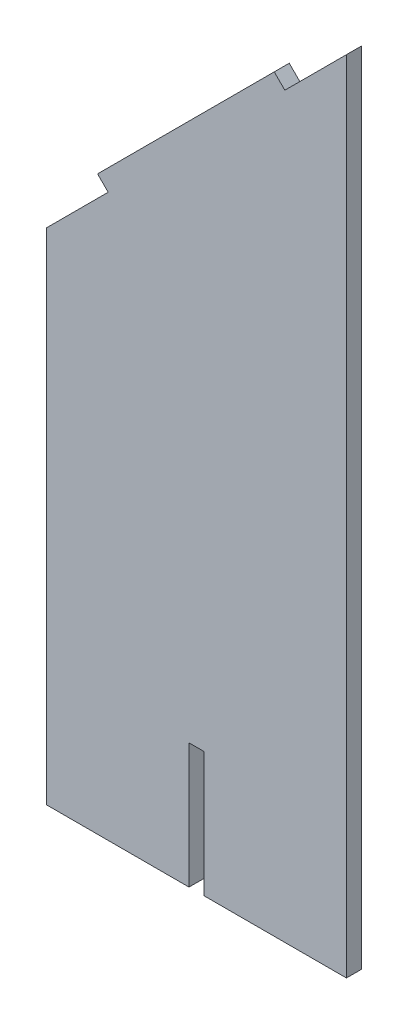
ISO-10303-21;
HEADER;
FILE_DESCRIPTION(('STEP AP214'),'2;1');
FILE_NAME('part.step','',(''),(''),'','','');
FILE_SCHEMA(('AUTOMOTIVE_DESIGN { 1 0 10303 214 1 1 1 1 }'));
ENDSEC;
DATA;
#1=APPLICATION_CONTEXT('core data for automotive mechanical design processes');
#2=APPLICATION_PROTOCOL_DEFINITION('international standard','automotive_design',2000,#1);
#3=PRODUCT_CONTEXT('',#1,'mechanical');
#4=PRODUCT('Part','Part','',(#3));
#5=PRODUCT_RELATED_PRODUCT_CATEGORY('part','',(#4));
#6=PRODUCT_DEFINITION_FORMATION('','',#4);
#7=PRODUCT_DEFINITION_CONTEXT('part definition',#1,'design');
#8=PRODUCT_DEFINITION('design','',#6,#7);
#9=PRODUCT_DEFINITION_SHAPE('','',#8);
#10=(LENGTH_UNIT() NAMED_UNIT(*) SI_UNIT(.MILLI.,.METRE.));
#11=(NAMED_UNIT(*) PLANE_ANGLE_UNIT() SI_UNIT($,.RADIAN.));
#12=(NAMED_UNIT(*) SI_UNIT($,.STERADIAN.) SOLID_ANGLE_UNIT());
#13=UNCERTAINTY_MEASURE_WITH_UNIT(LENGTH_MEASURE(1.E-05),#10,'distance_accuracy_value','');
#14=(GEOMETRIC_REPRESENTATION_CONTEXT(3) GLOBAL_UNCERTAINTY_ASSIGNED_CONTEXT((#13)) GLOBAL_UNIT_ASSIGNED_CONTEXT((#10,
#11,#12)) REPRESENTATION_CONTEXT('',''));
#15=CARTESIAN_POINT('',(0.,0.,0.));
#16=DIRECTION('',(0.,0.,1.));
#17=DIRECTION('',(1.,0.,0.));
#18=AXIS2_PLACEMENT_3D('',#15,#16,#17);
#19=CARTESIAN_POINT('',(-50.,49.9999999999998,3.));
#20=DIRECTION('',(-0.707106781186548,0.707106781186547,0.));
#21=DIRECTION('',(-0.707106781186547,-0.707106781186548,0.));
#22=AXIS2_PLACEMENT_3D('',#19,#20,#21);
#23=PLANE('',#22);
#24=DIRECTION('',(0.707106781186547,0.707106781186548,0.));
#25=VECTOR('',#24,1.);
#26=CARTESIAN_POINT('',(-50.,49.9999999999998,0.));
#27=LINE('',#26,#25);
#28=CARTESIAN_POINT('',(47.676674721503,147.676674721503,0.));
#29=VERTEX_POINT('',#28);
#30=CARTESIAN_POINT('',(60.,160.,0.));
#31=VERTEX_POINT('',#30);
#32=EDGE_CURVE('E154',#29,#31,#27,.T.);
#33=ORIENTED_EDGE('',*,*,#32,.F.);
#34=DIRECTION('',(0.,0.,-1.));
#35=VECTOR('',#34,1.);
#36=CARTESIAN_POINT('',(47.676674721503,147.676674721503,3.));
#37=LINE('',#36,#35);
#38=CARTESIAN_POINT('',(47.676674721503,147.676674721503,3.));
#39=VERTEX_POINT('',#38);
#40=EDGE_CURVE('E11',#39,#29,#37,.T.);
#41=ORIENTED_EDGE('',*,*,#40,.F.);
#42=DIRECTION('',(0.707106781186547,0.707106781186548,0.));
#43=VECTOR('',#42,1.);
#44=CARTESIAN_POINT('',(-50.,49.9999999999998,3.));
#45=LINE('',#44,#43);
#46=CARTESIAN_POINT('',(60.,160.,3.));
#47=VERTEX_POINT('',#46);
#48=EDGE_CURVE('E183',#39,#47,#45,.T.);
#49=ORIENTED_EDGE('',*,*,#48,.T.);
#50=DIRECTION('',(0.,0.,-1.));
#51=VECTOR('',#50,1.);
#52=CARTESIAN_POINT('',(60.,160.,3.));
#53=LINE('',#52,#51);
#54=EDGE_CURVE('E53',#47,#31,#53,.T.);
#55=ORIENTED_EDGE('',*,*,#54,.T.);
#56=EDGE_LOOP('',(#33,#41,#49,#55));
#57=FACE_BOUND('',#56,.T.);
#58=ADVANCED_FACE('F37',(#57),#23,.T.);
#59=CARTESIAN_POINT('',(97.6766747215031,97.6766747215025,3.));
#60=DIRECTION('',(0.70710678118655,0.707106781186545,0.));
#61=DIRECTION('',(-0.707106781186545,0.70710678118655,0.));
#62=AXIS2_PLACEMENT_3D('',#59,#60,#61);
#63=PLANE('',#62);
#64=DIRECTION('',(0.707106781186545,-0.70710678118655,0.));
#65=VECTOR('',#64,1.);
#66=CARTESIAN_POINT('',(97.6766747215031,97.6766747215025,0.));
#67=LINE('',#66,#65);
#68=CARTESIAN_POINT('',(45.5553543779433,149.797995065063,0.));
#69=VERTEX_POINT('',#68);
#70=EDGE_CURVE('E156',#69,#29,#67,.T.);
#71=ORIENTED_EDGE('',*,*,#70,.F.);
#72=DIRECTION('',(0.,0.,-1.));
#73=VECTOR('',#72,1.);
#74=CARTESIAN_POINT('',(45.5553543779433,149.797995065063,3.));
#75=LINE('',#74,#73);
#76=CARTESIAN_POINT('',(45.5553543779433,149.797995065063,3.));
#77=VERTEX_POINT('',#76);
#78=EDGE_CURVE('E45',#77,#69,#75,.T.);
#79=ORIENTED_EDGE('',*,*,#78,.F.);
#80=DIRECTION('',(0.707106781186545,-0.70710678118655,0.));
#81=VECTOR('',#80,1.);
#82=CARTESIAN_POINT('',(97.6766747215031,97.6766747215025,3.));
#83=LINE('',#82,#81);
#84=EDGE_CURVE('E222',#77,#39,#83,.T.);
#85=ORIENTED_EDGE('',*,*,#84,.T.);
#86=ORIENTED_EDGE('',*,*,#40,.T.);
#87=EDGE_LOOP('',(#71,#79,#85,#86));
#88=FACE_BOUND('',#87,.T.);
#89=ADVANCED_FACE('F210',(#88),#63,.T.);
#90=CARTESIAN_POINT('',(-52.1213203435597,52.1213203435596,3.));
#91=DIRECTION('',(-0.707106781186548,0.707106781186547,0.));
#92=DIRECTION('',(-0.707106781186547,-0.707106781186548,0.));
#93=AXIS2_PLACEMENT_3D('',#90,#91,#92);
#94=PLANE('',#93);
#95=DIRECTION('',(0.707106781186547,0.707106781186548,0.));
#96=VECTOR('',#95,1.);
#97=CARTESIAN_POINT('',(-52.1213203435597,52.1213203435596,0.));
#98=LINE('',#97,#96);
#99=CARTESIAN_POINT('',(10.2000153186159,114.442656005735,0.));
#100=VERTEX_POINT('',#99);
#101=EDGE_CURVE('E159',#100,#69,#98,.T.);
#102=ORIENTED_EDGE('',*,*,#101,.F.);
#103=DIRECTION('',(0.,0.,-1.));
#104=VECTOR('',#103,1.);
#105=CARTESIAN_POINT('',(10.2000153186159,114.442656005735,3.));
#106=LINE('',#105,#104);
#107=CARTESIAN_POINT('',(10.2000153186159,114.442656005735,3.));
#108=VERTEX_POINT('',#107);
#109=EDGE_CURVE('E199',#108,#100,#106,.T.);
#110=ORIENTED_EDGE('',*,*,#109,.F.);
#111=DIRECTION('',(0.707106781186547,0.707106781186548,0.));
#112=VECTOR('',#111,1.);
#113=CARTESIAN_POINT('',(-52.1213203435597,52.1213203435596,3.));
#114=LINE('',#113,#112);
#115=EDGE_CURVE('E206',#108,#77,#114,.T.);
#116=ORIENTED_EDGE('',*,*,#115,.T.);
#117=ORIENTED_EDGE('',*,*,#78,.T.);
#118=EDGE_LOOP('',(#102,#110,#116,#117));
#119=FACE_BOUND('',#118,.T.);
#120=ADVANCED_FACE('F204',(#119),#94,.T.);
#121=CARTESIAN_POINT('',(62.3213356621756,62.3213356621754,3.));
#122=DIRECTION('',(-0.707106781186548,-0.707106781186547,0.));
#123=DIRECTION('',(0.707106781186547,-0.707106781186548,0.));
#124=AXIS2_PLACEMENT_3D('',#121,#122,#123);
#125=PLANE('',#124);
#126=DIRECTION('',(-0.707106781186547,0.707106781186548,0.));
#127=VECTOR('',#126,1.);
#128=CARTESIAN_POINT('',(62.3213356621756,62.3213356621754,0.));
#129=LINE('',#128,#127);
#130=CARTESIAN_POINT('',(12.3213356621756,112.321335662176,0.));
#131=VERTEX_POINT('',#130);
#132=EDGE_CURVE('E162',#131,#100,#129,.T.);
#133=ORIENTED_EDGE('',*,*,#132,.F.);
#134=DIRECTION('',(0.,0.,-1.));
#135=VECTOR('',#134,1.);
#136=CARTESIAN_POINT('',(12.3213356621756,112.321335662176,3.));
#137=LINE('',#136,#135);
#138=CARTESIAN_POINT('',(12.3213356621756,112.321335662176,3.));
#139=VERTEX_POINT('',#138);
#140=EDGE_CURVE('E197',#139,#131,#137,.T.);
#141=ORIENTED_EDGE('',*,*,#140,.F.);
#142=DIRECTION('',(-0.707106781186547,0.707106781186548,0.));
#143=VECTOR('',#142,1.);
#144=CARTESIAN_POINT('',(62.3213356621756,62.3213356621754,3.));
#145=LINE('',#144,#143);
#146=EDGE_CURVE('E219',#139,#108,#145,.T.);
#147=ORIENTED_EDGE('',*,*,#146,.T.);
#148=ORIENTED_EDGE('',*,*,#109,.T.);
#149=EDGE_LOOP('',(#133,#141,#147,#148));
#150=FACE_BOUND('',#149,.T.);
#151=ADVANCED_FACE('F216',(#150),#125,.T.);
#152=CARTESIAN_POINT('',(-50.,50.,3.));
#153=DIRECTION('',(-0.707106781186548,0.707106781186547,0.));
#154=DIRECTION('',(-0.707106781186547,-0.707106781186548,0.));
#155=AXIS2_PLACEMENT_3D('',#152,#153,#154);
#156=PLANE('',#155);
#157=DIRECTION('',(0.707106781186547,0.707106781186548,0.));
#158=VECTOR('',#157,1.);
#159=CARTESIAN_POINT('',(-50.,50.,0.));
#160=LINE('',#159,#158);
#161=CARTESIAN_POINT('',(0.,100.,0.));
#162=VERTEX_POINT('',#161);
#163=EDGE_CURVE('E165',#162,#131,#160,.T.);
#164=ORIENTED_EDGE('',*,*,#163,.F.);
#165=DIRECTION('',(0.,0.,-1.));
#166=VECTOR('',#165,1.);
#167=CARTESIAN_POINT('',(0.,100.,3.));
#168=LINE('',#167,#166);
#169=CARTESIAN_POINT('',(0.,100.,3.));
#170=VERTEX_POINT('',#169);
#171=EDGE_CURVE('E195',#170,#162,#168,.T.);
#172=ORIENTED_EDGE('',*,*,#171,.F.);
#173=DIRECTION('',(0.707106781186547,0.707106781186548,0.));
#174=VECTOR('',#173,1.);
#175=CARTESIAN_POINT('',(-50.,50.,3.));
#176=LINE('',#175,#174);
#177=EDGE_CURVE('E224',#170,#139,#176,.T.);
#178=ORIENTED_EDGE('',*,*,#177,.T.);
#179=ORIENTED_EDGE('',*,*,#140,.T.);
#180=EDGE_LOOP('',(#164,#172,#178,#179));
#181=FACE_BOUND('',#180,.T.);
#182=ADVANCED_FACE('F268',(#181),#156,.T.);
#183=CARTESIAN_POINT('',(0.,0.,3.));
#184=DIRECTION('',(-1.,0.,0.));
#185=DIRECTION('',(0.,0.,1.));
#186=AXIS2_PLACEMENT_3D('',#183,#184,#185);
#187=PLANE('',#186);
#188=DIRECTION('',(0.,1.,0.));
#189=VECTOR('',#188,1.);
#190=CARTESIAN_POINT('',(0.,0.,0.));
#191=LINE('',#190,#189);
#192=CARTESIAN_POINT('',(0.,0.,0.));
#193=VERTEX_POINT('',#192);
#194=EDGE_CURVE('E168',#193,#162,#191,.T.);
#195=ORIENTED_EDGE('',*,*,#194,.F.);
#196=DIRECTION('',(0.,0.,-1.));
#197=VECTOR('',#196,1.);
#198=CARTESIAN_POINT('',(0.,0.,3.));
#199=LINE('',#198,#197);
#200=CARTESIAN_POINT('',(0.,0.,3.));
#201=VERTEX_POINT('',#200);
#202=EDGE_CURVE('E193',#201,#193,#199,.T.);
#203=ORIENTED_EDGE('',*,*,#202,.F.);
#204=DIRECTION('',(0.,1.,0.));
#205=VECTOR('',#204,1.);
#206=CARTESIAN_POINT('',(0.,0.,3.));
#207=LINE('',#206,#205);
#208=EDGE_CURVE('E230',#201,#170,#207,.T.);
#209=ORIENTED_EDGE('',*,*,#208,.T.);
#210=ORIENTED_EDGE('',*,*,#171,.T.);
#211=EDGE_LOOP('',(#195,#203,#209,#210));
#212=FACE_BOUND('',#211,.T.);
#213=ADVANCED_FACE('F271',(#212),#187,.T.);
#214=CARTESIAN_POINT('',(0.,0.,3.));
#215=DIRECTION('',(0.,1.,0.));
#216=DIRECTION('',(0.,0.,1.));
#217=AXIS2_PLACEMENT_3D('',#214,#215,#216);
#218=PLANE('',#217);
#219=DIRECTION('',(1.,0.,0.));
#220=VECTOR('',#219,1.);
#221=CARTESIAN_POINT('',(0.,0.,0.));
#222=LINE('',#221,#220);
#223=CARTESIAN_POINT('',(28.5,0.,0.));
#224=VERTEX_POINT('',#223);
#225=EDGE_CURVE('E171',#193,#224,#222,.T.);
#226=ORIENTED_EDGE('',*,*,#225,.T.);
#227=DIRECTION('',(0.,0.,-1.));
#228=VECTOR('',#227,1.);
#229=CARTESIAN_POINT('',(28.5,0.,3.));
#230=LINE('',#229,#228);
#231=CARTESIAN_POINT('',(28.5,0.,3.));
#232=VERTEX_POINT('',#231);
#233=EDGE_CURVE('E190',#232,#224,#230,.T.);
#234=ORIENTED_EDGE('',*,*,#233,.F.);
#235=DIRECTION('',(1.,0.,0.));
#236=VECTOR('',#235,1.);
#237=CARTESIAN_POINT('',(0.,0.,3.));
#238=LINE('',#237,#236);
#239=EDGE_CURVE('E233',#201,#232,#238,.T.);
#240=ORIENTED_EDGE('',*,*,#239,.F.);
#241=ORIENTED_EDGE('',*,*,#202,.T.);
#242=EDGE_LOOP('',(#226,#234,#240,#241));
#243=FACE_BOUND('',#242,.T.);
#244=ADVANCED_FACE('F275',(#243),#218,.F.);
#245=CARTESIAN_POINT('',(28.5,0.,3.));
#246=DIRECTION('',(-1.,0.,0.));
#247=DIRECTION('',(0.,0.,1.));
#248=AXIS2_PLACEMENT_3D('',#245,#246,#247);
#249=PLANE('',#248);
#250=DIRECTION('',(0.,1.,0.));
#251=VECTOR('',#250,1.);
#252=CARTESIAN_POINT('',(28.5,0.,0.));
#253=LINE('',#252,#251);
#254=CARTESIAN_POINT('',(28.5,25.,0.));
#255=VERTEX_POINT('',#254);
#256=EDGE_CURVE('E173',#224,#255,#253,.T.);
#257=ORIENTED_EDGE('',*,*,#256,.T.);
#258=DIRECTION('',(0.,0.,-1.));
#259=VECTOR('',#258,1.);
#260=CARTESIAN_POINT('',(28.5,25.,3.));
#261=LINE('',#260,#259);
#262=CARTESIAN_POINT('',(28.5,25.,3.));
#263=VERTEX_POINT('',#262);
#264=EDGE_CURVE('E187',#263,#255,#261,.T.);
#265=ORIENTED_EDGE('',*,*,#264,.F.);
#266=DIRECTION('',(0.,1.,0.));
#267=VECTOR('',#266,1.);
#268=CARTESIAN_POINT('',(28.5,0.,3.));
#269=LINE('',#268,#267);
#270=EDGE_CURVE('E235',#232,#263,#269,.T.);
#271=ORIENTED_EDGE('',*,*,#270,.F.);
#272=ORIENTED_EDGE('',*,*,#233,.T.);
#273=EDGE_LOOP('',(#257,#265,#271,#272));
#274=FACE_BOUND('',#273,.T.);
#275=ADVANCED_FACE('F242',(#274),#249,.F.);
#276=CARTESIAN_POINT('',(0.,25.,3.));
#277=DIRECTION('',(0.,1.,0.));
#278=DIRECTION('',(0.,0.,1.));
#279=AXIS2_PLACEMENT_3D('',#276,#277,#278);
#280=PLANE('',#279);
#281=DIRECTION('',(1.,0.,0.));
#282=VECTOR('',#281,1.);
#283=CARTESIAN_POINT('',(0.,25.,0.));
#284=LINE('',#283,#282);
#285=CARTESIAN_POINT('',(31.5,25.,0.));
#286=VERTEX_POINT('',#285);
#287=EDGE_CURVE('E175',#255,#286,#284,.T.);
#288=ORIENTED_EDGE('',*,*,#287,.T.);
#289=DIRECTION('',(0.,0.,-1.));
#290=VECTOR('',#289,1.);
#291=CARTESIAN_POINT('',(31.5,25.,3.));
#292=LINE('',#291,#290);
#293=CARTESIAN_POINT('',(31.5,25.,3.));
#294=VERTEX_POINT('',#293);
#295=EDGE_CURVE('E146',#294,#286,#292,.T.);
#296=ORIENTED_EDGE('',*,*,#295,.F.);
#297=DIRECTION('',(1.,0.,0.));
#298=VECTOR('',#297,1.);
#299=CARTESIAN_POINT('',(0.,25.,3.));
#300=LINE('',#299,#298);
#301=EDGE_CURVE('E134',#263,#294,#300,.T.);
#302=ORIENTED_EDGE('',*,*,#301,.F.);
#303=ORIENTED_EDGE('',*,*,#264,.T.);
#304=EDGE_LOOP('',(#288,#296,#302,#303));
#305=FACE_BOUND('',#304,.T.);
#306=ADVANCED_FACE('F246',(#305),#280,.F.);
#307=CARTESIAN_POINT('',(31.5,0.,3.));
#308=DIRECTION('',(1.,0.,0.));
#309=DIRECTION('',(0.,0.,-1.));
#310=AXIS2_PLACEMENT_3D('',#307,#308,#309);
#311=PLANE('',#310);
#312=DIRECTION('',(0.,-1.,0.));
#313=VECTOR('',#312,1.);
#314=CARTESIAN_POINT('',(31.5,0.,0.));
#315=LINE('',#314,#313);
#316=CARTESIAN_POINT('',(31.5,0.,0.));
#317=VERTEX_POINT('',#316);
#318=EDGE_CURVE('E143',#286,#317,#315,.T.);
#319=ORIENTED_EDGE('',*,*,#318,.T.);
#320=DIRECTION('',(0.,0.,-1.));
#321=VECTOR('',#320,1.);
#322=CARTESIAN_POINT('',(31.5,0.,3.));
#323=LINE('',#322,#321);
#324=CARTESIAN_POINT('',(31.5,0.,3.));
#325=VERTEX_POINT('',#324);
#326=EDGE_CURVE('E140',#325,#317,#323,.T.);
#327=ORIENTED_EDGE('',*,*,#326,.F.);
#328=DIRECTION('',(0.,-1.,0.));
#329=VECTOR('',#328,1.);
#330=CARTESIAN_POINT('',(31.5,0.,3.));
#331=LINE('',#330,#329);
#332=EDGE_CURVE('E127',#294,#325,#331,.T.);
#333=ORIENTED_EDGE('',*,*,#332,.F.);
#334=ORIENTED_EDGE('',*,*,#295,.T.);
#335=EDGE_LOOP('',(#319,#327,#333,#334));
#336=FACE_BOUND('',#335,.T.);
#337=ADVANCED_FACE('F141',(#336),#311,.F.);
#338=CARTESIAN_POINT('',(0.,0.,3.));
#339=DIRECTION('',(0.,1.,0.));
#340=DIRECTION('',(0.,0.,1.));
#341=AXIS2_PLACEMENT_3D('',#338,#339,#340);
#342=PLANE('',#341);
#343=DIRECTION('',(1.,0.,0.));
#344=VECTOR('',#343,1.);
#345=CARTESIAN_POINT('',(0.,0.,0.));
#346=LINE('',#345,#344);
#347=CARTESIAN_POINT('',(60.,0.,0.));
#348=VERTEX_POINT('',#347);
#349=EDGE_CURVE('E178',#317,#348,#346,.T.);
#350=ORIENTED_EDGE('',*,*,#349,.T.);
#351=DIRECTION('',(0.,0.,-1.));
#352=VECTOR('',#351,1.);
#353=CARTESIAN_POINT('',(60.,0.,3.));
#354=LINE('',#353,#352);
#355=CARTESIAN_POINT('',(60.,0.,3.));
#356=VERTEX_POINT('',#355);
#357=EDGE_CURVE('E91',#356,#348,#354,.T.);
#358=ORIENTED_EDGE('',*,*,#357,.F.);
#359=DIRECTION('',(1.,0.,0.));
#360=VECTOR('',#359,1.);
#361=CARTESIAN_POINT('',(0.,0.,3.));
#362=LINE('',#361,#360);
#363=EDGE_CURVE('E132',#325,#356,#362,.T.);
#364=ORIENTED_EDGE('',*,*,#363,.F.);
#365=ORIENTED_EDGE('',*,*,#326,.T.);
#366=EDGE_LOOP('',(#350,#358,#364,#365));
#367=FACE_BOUND('',#366,.T.);
#368=ADVANCED_FACE('F148',(#367),#342,.F.);
#369=CARTESIAN_POINT('',(60.,0.,3.));
#370=DIRECTION('',(1.,0.,0.));
#371=DIRECTION('',(0.,0.,-1.));
#372=AXIS2_PLACEMENT_3D('',#369,#370,#371);
#373=PLANE('',#372);
#374=DIRECTION('',(0.,-1.,0.));
#375=VECTOR('',#374,1.);
#376=CARTESIAN_POINT('',(60.,0.,0.));
#377=LINE('',#376,#375);
#378=EDGE_CURVE('E180',#31,#348,#377,.T.);
#379=ORIENTED_EDGE('',*,*,#378,.F.);
#380=ORIENTED_EDGE('',*,*,#54,.F.);
#381=DIRECTION('',(0.,-1.,0.));
#382=VECTOR('',#381,1.);
#383=CARTESIAN_POINT('',(60.,0.,3.));
#384=LINE('',#383,#382);
#385=EDGE_CURVE('E149',#47,#356,#384,.T.);
#386=ORIENTED_EDGE('',*,*,#385,.T.);
#387=ORIENTED_EDGE('',*,*,#357,.T.);
#388=EDGE_LOOP('',(#379,#380,#386,#387));
#389=FACE_BOUND('',#388,.T.);
#390=ADVANCED_FACE('F247',(#389),#373,.T.);
#391=CARTESIAN_POINT('',(0.,0.,3.));
#392=DIRECTION('',(0.,0.,1.));
#393=DIRECTION('',(1.,0.,0.));
#394=AXIS2_PLACEMENT_3D('',#391,#392,#393);
#395=PLANE('',#394);
#396=ORIENTED_EDGE('',*,*,#48,.F.);
#397=ORIENTED_EDGE('',*,*,#84,.F.);
#398=ORIENTED_EDGE('',*,*,#115,.F.);
#399=ORIENTED_EDGE('',*,*,#146,.F.);
#400=ORIENTED_EDGE('',*,*,#177,.F.);
#401=ORIENTED_EDGE('',*,*,#208,.F.);
#402=ORIENTED_EDGE('',*,*,#239,.T.);
#403=ORIENTED_EDGE('',*,*,#270,.T.);
#404=ORIENTED_EDGE('',*,*,#301,.T.);
#405=ORIENTED_EDGE('',*,*,#332,.T.);
#406=ORIENTED_EDGE('',*,*,#363,.T.);
#407=ORIENTED_EDGE('',*,*,#385,.F.);
#408=EDGE_LOOP('',(#396,#397,#398,#399,#400,#401,#402,#403,#404,#405,#406,#407));
#409=FACE_BOUND('',#408,.T.);
#410=ADVANCED_FACE('F129',(#409),#395,.T.);
#411=CARTESIAN_POINT('',(0.,0.,0.));
#412=DIRECTION('',(0.,0.,1.));
#413=DIRECTION('',(1.,0.,0.));
#414=AXIS2_PLACEMENT_3D('',#411,#412,#413);
#415=PLANE('',#414);
#416=ORIENTED_EDGE('',*,*,#32,.T.);
#417=ORIENTED_EDGE('',*,*,#378,.T.);
#418=ORIENTED_EDGE('',*,*,#349,.F.);
#419=ORIENTED_EDGE('',*,*,#318,.F.);
#420=ORIENTED_EDGE('',*,*,#287,.F.);
#421=ORIENTED_EDGE('',*,*,#256,.F.);
#422=ORIENTED_EDGE('',*,*,#225,.F.);
#423=ORIENTED_EDGE('',*,*,#194,.T.);
#424=ORIENTED_EDGE('',*,*,#163,.T.);
#425=ORIENTED_EDGE('',*,*,#132,.T.);
#426=ORIENTED_EDGE('',*,*,#101,.T.);
#427=ORIENTED_EDGE('',*,*,#70,.T.);
#428=EDGE_LOOP('',(#416,#417,#418,#419,#420,#421,#422,#423,#424,#425,#426,#427));
#429=FACE_BOUND('',#428,.T.);
#430=ADVANCED_FACE('F212',(#429),#415,.F.);
#431=CLOSED_SHELL('',(#58,#89,#120,#151,#182,#213,#244,#275,#306,#337,#368,#390,#410,#430));
#432=MANIFOLD_SOLID_BREP('B2',#431);
#433=ADVANCED_BREP_SHAPE_REPRESENTATION('',(#18,#432),#14);
#434=SHAPE_DEFINITION_REPRESENTATION(#9,#433);
ENDSEC;
END-ISO-10303-21;
